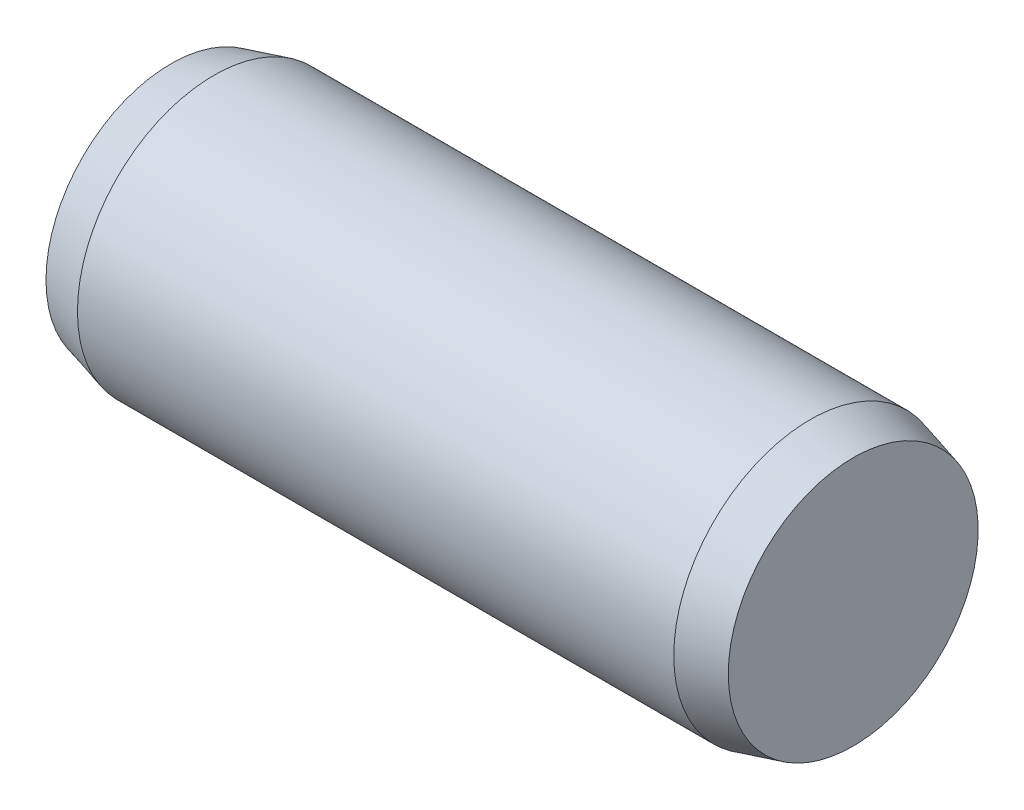
ISO-10303-21;
HEADER;
FILE_DESCRIPTION(('STEP AP214'),'2;1');
FILE_NAME('part.step','',(''),(''),'','','');
FILE_SCHEMA(('AUTOMOTIVE_DESIGN { 1 0 10303 214 1 1 1 1 }'));
ENDSEC;
DATA;
#1=APPLICATION_CONTEXT('core data for automotive mechanical design processes');
#2=APPLICATION_PROTOCOL_DEFINITION('international standard','automotive_design',2000,#1);
#3=PRODUCT_CONTEXT('',#1,'mechanical');
#4=PRODUCT('Part','Part','',(#3));
#5=PRODUCT_RELATED_PRODUCT_CATEGORY('part','',(#4));
#6=PRODUCT_DEFINITION_FORMATION('','',#4);
#7=PRODUCT_DEFINITION_CONTEXT('part definition',#1,'design');
#8=PRODUCT_DEFINITION('design','',#6,#7);
#9=PRODUCT_DEFINITION_SHAPE('','',#8);
#10=(LENGTH_UNIT() NAMED_UNIT(*) SI_UNIT(.MILLI.,.METRE.));
#11=(NAMED_UNIT(*) PLANE_ANGLE_UNIT() SI_UNIT($,.RADIAN.));
#12=(NAMED_UNIT(*) SI_UNIT($,.STERADIAN.) SOLID_ANGLE_UNIT());
#13=UNCERTAINTY_MEASURE_WITH_UNIT(LENGTH_MEASURE(1.E-05),#10,'distance_accuracy_value','');
#14=(GEOMETRIC_REPRESENTATION_CONTEXT(3) GLOBAL_UNCERTAINTY_ASSIGNED_CONTEXT((#13)) GLOBAL_UNIT_ASSIGNED_CONTEXT((#10,
#11,#12)) REPRESENTATION_CONTEXT('',''));
#15=CARTESIAN_POINT('',(0.,0.,0.));
#16=DIRECTION('',(0.,0.,1.));
#17=DIRECTION('',(1.,0.,0.));
#18=AXIS2_PLACEMENT_3D('',#15,#16,#17);
#19=CARTESIAN_POINT('',(0.,1.8311920087684,0.));
#20=DIRECTION('',(1.,0.,0.));
#21=DIRECTION('',(0.,0.,-1.));
#22=AXIS2_PLACEMENT_3D('',#19,#20,#21);
#23=PLANE('',#22);
#24=CARTESIAN_POINT('',(0.,0.,0.));
#25=DIRECTION('',(-1.,0.,0.));
#26=DIRECTION('',(0.,0.,1.));
#27=AXIS2_PLACEMENT_3D('',#24,#25,#26);
#28=CIRCLE('',#27,1.8311920087684);
#29=CARTESIAN_POINT('',(0.,0.,1.8311920087684));
#30=VERTEX_POINT('',#29);
#31=EDGE_CURVE('E45',#30,#30,#28,.T.);
#32=ORIENTED_EDGE('',*,*,#31,.T.);
#33=EDGE_LOOP('',(#32));
#34=FACE_BOUND('',#33,.T.);
#35=ADVANCED_FACE('F31',(#34),#23,.F.);
#36=CARTESIAN_POINT('',(10.,0.,0.));
#37=DIRECTION('',(-1.,0.,0.));
#38=DIRECTION('',(0.,0.,1.));
#39=AXIS2_PLACEMENT_3D('',#36,#37,#38);
#40=PLANE('',#39);
#41=CARTESIAN_POINT('',(10.,0.,0.));
#42=DIRECTION('',(-1.,0.,0.));
#43=DIRECTION('',(0.,0.,1.));
#44=AXIS2_PLACEMENT_3D('',#41,#42,#43);
#45=CIRCLE('',#44,1.83119200876839);
#46=CARTESIAN_POINT('',(10.,0.,1.83119200876839));
#47=VERTEX_POINT('',#46);
#48=EDGE_CURVE('E10',#47,#47,#45,.T.);
#49=ORIENTED_EDGE('',*,*,#48,.F.);
#50=EDGE_LOOP('',(#49));
#51=FACE_BOUND('',#50,.T.);
#52=ADVANCED_FACE('F65',(#51),#40,.F.);
#53=CARTESIAN_POINT('',(10.,0.,0.));
#54=DIRECTION('',(-1.,0.,0.));
#55=DIRECTION('',(0.,0.,1.));
#56=AXIS2_PLACEMENT_3D('',#53,#54,#55);
#57=CONICAL_SURFACE('',#56,1.83119200876839,0.261799387799148);
#58=CARTESIAN_POINT('',(9.37,0.,0.));
#59=DIRECTION('',(-1.,0.,0.));
#60=DIRECTION('',(0.,0.,1.));
#61=AXIS2_PLACEMENT_3D('',#58,#59,#60);
#62=CIRCLE('',#61,2.);
#63=CARTESIAN_POINT('',(9.37,0.,2.));
#64=VERTEX_POINT('',#63);
#65=EDGE_CURVE('E37',#64,#64,#62,.T.);
#66=ORIENTED_EDGE('',*,*,#65,.F.);
#67=EDGE_LOOP('',(#66));
#68=FACE_BOUND('',#67,.T.);
#69=ORIENTED_EDGE('',*,*,#48,.T.);
#70=EDGE_LOOP('',(#69));
#71=FACE_BOUND('',#70,.T.);
#72=ADVANCED_FACE('F60',(#68,#71),#57,.T.);
#73=CARTESIAN_POINT('',(-6.35,0.,0.));
#74=DIRECTION('',(-1.,0.,0.));
#75=DIRECTION('',(0.,0.,1.));
#76=AXIS2_PLACEMENT_3D('',#73,#74,#75);
#77=CYLINDRICAL_SURFACE('',#76,2.);
#78=CARTESIAN_POINT('',(0.63,0.,0.));
#79=DIRECTION('',(-1.,0.,0.));
#80=DIRECTION('',(0.,0.,1.));
#81=AXIS2_PLACEMENT_3D('',#78,#79,#80);
#82=CIRCLE('',#81,2.);
#83=CARTESIAN_POINT('',(0.63,0.,2.));
#84=VERTEX_POINT('',#83);
#85=EDGE_CURVE('E41',#84,#84,#82,.T.);
#86=ORIENTED_EDGE('',*,*,#85,.F.);
#87=EDGE_LOOP('',(#86));
#88=FACE_BOUND('',#87,.T.);
#89=ORIENTED_EDGE('',*,*,#65,.T.);
#90=EDGE_LOOP('',(#89));
#91=FACE_BOUND('',#90,.T.);
#92=ADVANCED_FACE('F55',(#88,#91),#77,.T.);
#93=CARTESIAN_POINT('',(0.63,0.,0.));
#94=DIRECTION('',(1.,0.,0.));
#95=DIRECTION('',(0.,0.,-1.));
#96=AXIS2_PLACEMENT_3D('',#93,#94,#95);
#97=CONICAL_SURFACE('',#96,2.,0.261799387799143);
#98=ORIENTED_EDGE('',*,*,#31,.F.);
#99=EDGE_LOOP('',(#98));
#100=FACE_BOUND('',#99,.T.);
#101=ORIENTED_EDGE('',*,*,#85,.T.);
#102=EDGE_LOOP('',(#101));
#103=FACE_BOUND('',#102,.T.);
#104=ADVANCED_FACE('F52',(#100,#103),#97,.T.);
#105=CLOSED_SHELL('',(#35,#52,#72,#92,#104));
#106=MANIFOLD_SOLID_BREP('B2',#105);
#107=ADVANCED_BREP_SHAPE_REPRESENTATION('',(#18,#106),#14);
#108=SHAPE_DEFINITION_REPRESENTATION(#9,#107);
ENDSEC;
END-ISO-10303-21;
